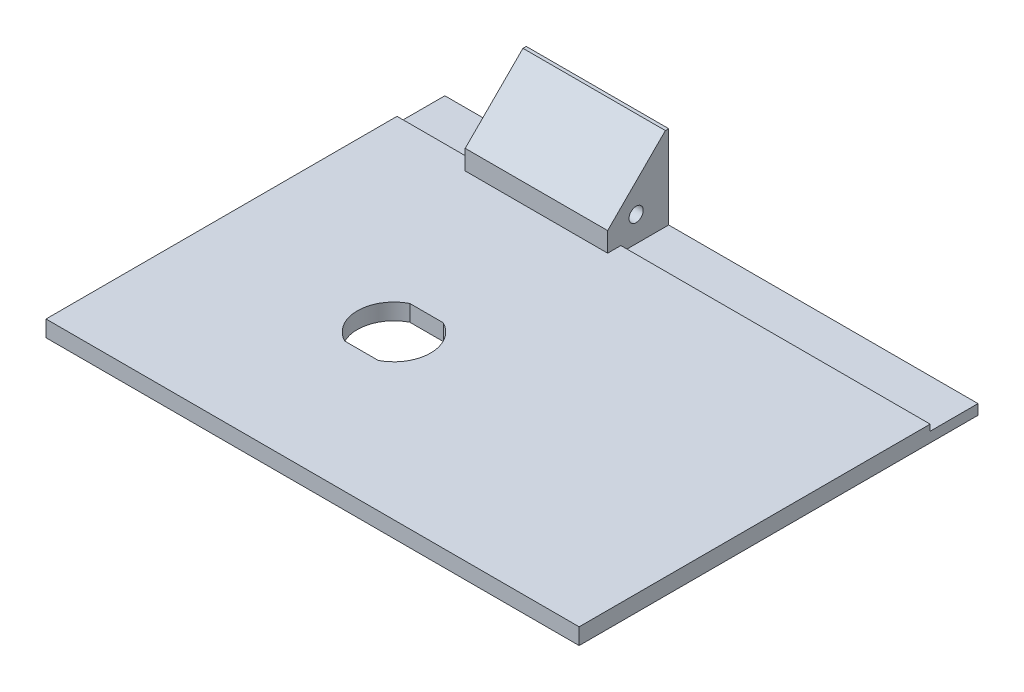
ISO-10303-21;
HEADER;
FILE_DESCRIPTION(('STEP AP214'),'2;1');
FILE_NAME('part.step','',(''),(''),'','','');
FILE_SCHEMA(('AUTOMOTIVE_DESIGN { 1 0 10303 214 1 1 1 1 }'));
ENDSEC;
DATA;
#1=APPLICATION_CONTEXT('core data for automotive mechanical design processes');
#2=APPLICATION_PROTOCOL_DEFINITION('international standard','automotive_design',2000,#1);
#3=PRODUCT_CONTEXT('',#1,'mechanical');
#4=PRODUCT('Part','Part','',(#3));
#5=PRODUCT_RELATED_PRODUCT_CATEGORY('part','',(#4));
#6=PRODUCT_DEFINITION_FORMATION('','',#4);
#7=PRODUCT_DEFINITION_CONTEXT('part definition',#1,'design');
#8=PRODUCT_DEFINITION('design','',#6,#7);
#9=PRODUCT_DEFINITION_SHAPE('','',#8);
#10=(LENGTH_UNIT() NAMED_UNIT(*) SI_UNIT(.MILLI.,.METRE.));
#11=(NAMED_UNIT(*) PLANE_ANGLE_UNIT() SI_UNIT($,.RADIAN.));
#12=(NAMED_UNIT(*) SI_UNIT($,.STERADIAN.) SOLID_ANGLE_UNIT());
#13=UNCERTAINTY_MEASURE_WITH_UNIT(LENGTH_MEASURE(1.E-05),#10,'distance_accuracy_value','');
#14=(GEOMETRIC_REPRESENTATION_CONTEXT(3) GLOBAL_UNCERTAINTY_ASSIGNED_CONTEXT((#13)) GLOBAL_UNIT_ASSIGNED_CONTEXT((#10,
#11,#12)) REPRESENTATION_CONTEXT('',''));
#15=CARTESIAN_POINT('',(0.,0.,0.));
#16=DIRECTION('',(0.,0.,1.));
#17=DIRECTION('',(1.,0.,0.));
#18=AXIS2_PLACEMENT_3D('',#15,#16,#17);
#19=CARTESIAN_POINT('',(77.3453577404821,4.,-37.25));
#20=DIRECTION('',(0.,0.,1.));
#21=DIRECTION('',(1.,0.,0.));
#22=AXIS2_PLACEMENT_3D('',#19,#20,#21);
#23=PLANE('',#22);
#24=DIRECTION('',(-1.,0.,0.));
#25=VECTOR('',#24,1.);
#26=CARTESIAN_POINT('',(77.3453577404821,2.5,-37.25));
#27=LINE('',#26,#25);
#28=CARTESIAN_POINT('',(65.5,2.5,-37.25));
#29=VERTEX_POINT('',#28);
#30=CARTESIAN_POINT('',(-10.5,2.5,-37.25));
#31=VERTEX_POINT('',#30);
#32=EDGE_CURVE('E160',#29,#31,#27,.T.);
#33=ORIENTED_EDGE('',*,*,#32,.T.);
#34=DIRECTION('',(0.,-1.,0.));
#35=VECTOR('',#34,1.);
#36=CARTESIAN_POINT('',(-10.5,4.,-37.25));
#37=LINE('',#36,#35);
#38=CARTESIAN_POINT('',(-10.5,4.,-37.25));
#39=VERTEX_POINT('',#38);
#40=EDGE_CURVE('E155',#39,#31,#37,.T.);
#41=ORIENTED_EDGE('',*,*,#40,.F.);
#42=DIRECTION('',(-1.,0.,0.));
#43=VECTOR('',#42,1.);
#44=CARTESIAN_POINT('',(77.3453577404821,4.,-37.25));
#45=LINE('',#44,#43);
#46=CARTESIAN_POINT('',(65.5,4.,-37.25));
#47=VERTEX_POINT('',#46);
#48=EDGE_CURVE('E157',#47,#39,#45,.T.);
#49=ORIENTED_EDGE('',*,*,#48,.F.);
#50=DIRECTION('',(0.,-1.,0.));
#51=VECTOR('',#50,1.);
#52=CARTESIAN_POINT('',(65.5,4.,-37.25));
#53=LINE('',#52,#51);
#54=EDGE_CURVE('E176',#47,#29,#53,.T.);
#55=ORIENTED_EDGE('',*,*,#54,.T.);
#56=EDGE_LOOP('',(#33,#41,#49,#55));
#57=FACE_BOUND('',#56,.T.);
#58=ADVANCED_FACE('F36',(#57),#23,.F.);
#59=CARTESIAN_POINT('',(77.3453577404821,2.5,-49.));
#60=DIRECTION('',(0.,-1.,0.));
#61=DIRECTION('',(0.,0.,-1.));
#62=AXIS2_PLACEMENT_3D('',#59,#60,#61);
#63=PLANE('',#62);
#64=DIRECTION('',(-1.,0.,0.));
#65=VECTOR('',#64,1.);
#66=CARTESIAN_POINT('',(77.3453577404821,2.5,-49.));
#67=LINE('',#66,#65);
#68=CARTESIAN_POINT('',(65.5,2.5,-49.));
#69=VERTEX_POINT('',#68);
#70=CARTESIAN_POINT('',(-10.5,2.5,-49.));
#71=VERTEX_POINT('',#70);
#72=EDGE_CURVE('E211',#69,#71,#67,.T.);
#73=ORIENTED_EDGE('',*,*,#72,.T.);
#74=DIRECTION('',(0.,0.,-1.));
#75=VECTOR('',#74,1.);
#76=CARTESIAN_POINT('',(-10.5,2.5,-2.21787188879326));
#77=LINE('',#76,#75);
#78=EDGE_CURVE('E165',#31,#71,#77,.T.);
#79=ORIENTED_EDGE('',*,*,#78,.F.);
#80=ORIENTED_EDGE('',*,*,#32,.F.);
#81=DIRECTION('',(0.,0.,-1.));
#82=VECTOR('',#81,1.);
#83=CARTESIAN_POINT('',(65.5,2.5,-49.));
#84=LINE('',#83,#82);
#85=EDGE_CURVE('E202',#29,#69,#84,.T.);
#86=ORIENTED_EDGE('',*,*,#85,.T.);
#87=EDGE_LOOP('',(#73,#79,#80,#86));
#88=FACE_BOUND('',#87,.T.);
#89=ADVANCED_FACE('F313',(#88),#63,.F.);
#90=CARTESIAN_POINT('',(-65.5,4.,49.));
#91=DIRECTION('',(1.,0.,0.));
#92=DIRECTION('',(0.,0.,-1.));
#93=AXIS2_PLACEMENT_3D('',#90,#91,#92);
#94=PLANE('',#93);
#95=DIRECTION('',(0.,0.,1.));
#96=VECTOR('',#95,1.);
#97=CARTESIAN_POINT('',(-65.5,4.,49.));
#98=LINE('',#97,#96);
#99=CARTESIAN_POINT('',(-65.5,4.,-37.25));
#100=VERTEX_POINT('',#99);
#101=CARTESIAN_POINT('',(-65.5,4.,49.));
#102=VERTEX_POINT('',#101);
#103=EDGE_CURVE('E248',#100,#102,#98,.T.);
#104=ORIENTED_EDGE('',*,*,#103,.F.);
#105=DIRECTION('',(0.,1.,0.));
#106=VECTOR('',#105,1.);
#107=CARTESIAN_POINT('',(-65.5,4.,-37.25));
#108=LINE('',#107,#106);
#109=CARTESIAN_POINT('',(-65.5,2.5,-37.25));
#110=VERTEX_POINT('',#109);
#111=EDGE_CURVE('E205',#110,#100,#108,.T.);
#112=ORIENTED_EDGE('',*,*,#111,.F.);
#113=DIRECTION('',(0.,0.,1.));
#114=VECTOR('',#113,1.);
#115=CARTESIAN_POINT('',(-65.5,2.5,-49.));
#116=LINE('',#115,#114);
#117=CARTESIAN_POINT('',(-65.5,2.5,-49.));
#118=VERTEX_POINT('',#117);
#119=EDGE_CURVE('E200',#118,#110,#116,.T.);
#120=ORIENTED_EDGE('',*,*,#119,.F.);
#121=DIRECTION('',(0.,-1.,0.));
#122=VECTOR('',#121,1.);
#123=CARTESIAN_POINT('',(-65.5,4.,-49.));
#124=LINE('',#123,#122);
#125=CARTESIAN_POINT('',(-65.5,0.,-49.));
#126=VERTEX_POINT('',#125);
#127=EDGE_CURVE('E254',#118,#126,#124,.T.);
#128=ORIENTED_EDGE('',*,*,#127,.T.);
#129=DIRECTION('',(0.,0.,1.));
#130=VECTOR('',#129,1.);
#131=CARTESIAN_POINT('',(-65.5,0.,49.));
#132=LINE('',#131,#130);
#133=CARTESIAN_POINT('',(-65.5,0.,49.));
#134=VERTEX_POINT('',#133);
#135=EDGE_CURVE('E241',#126,#134,#132,.T.);
#136=ORIENTED_EDGE('',*,*,#135,.T.);
#137=DIRECTION('',(0.,-1.,0.));
#138=VECTOR('',#137,1.);
#139=CARTESIAN_POINT('',(-65.5,4.,49.));
#140=LINE('',#139,#138);
#141=EDGE_CURVE('E269',#102,#134,#140,.T.);
#142=ORIENTED_EDGE('',*,*,#141,.F.);
#143=EDGE_LOOP('',(#104,#112,#120,#128,#136,#142));
#144=FACE_BOUND('',#143,.T.);
#145=ADVANCED_FACE('F38',(#144),#94,.F.);
#146=CARTESIAN_POINT('',(65.5,4.,49.));
#147=DIRECTION('',(0.,0.,-1.));
#148=DIRECTION('',(-1.,0.,0.));
#149=AXIS2_PLACEMENT_3D('',#146,#147,#148);
#150=PLANE('',#149);
#151=DIRECTION('',(1.,0.,0.));
#152=VECTOR('',#151,1.);
#153=CARTESIAN_POINT('',(65.5,0.,49.));
#154=LINE('',#153,#152);
#155=CARTESIAN_POINT('',(65.5,0.,49.));
#156=VERTEX_POINT('',#155);
#157=EDGE_CURVE('E257',#134,#156,#154,.T.);
#158=ORIENTED_EDGE('',*,*,#157,.T.);
#159=DIRECTION('',(0.,-1.,0.));
#160=VECTOR('',#159,1.);
#161=CARTESIAN_POINT('',(65.5,4.,49.));
#162=LINE('',#161,#160);
#163=CARTESIAN_POINT('',(65.5,4.,49.));
#164=VERTEX_POINT('',#163);
#165=EDGE_CURVE('E267',#164,#156,#162,.T.);
#166=ORIENTED_EDGE('',*,*,#165,.F.);
#167=DIRECTION('',(1.,0.,0.));
#168=VECTOR('',#167,1.);
#169=CARTESIAN_POINT('',(65.5,4.,49.));
#170=LINE('',#169,#168);
#171=EDGE_CURVE('E250',#102,#164,#170,.T.);
#172=ORIENTED_EDGE('',*,*,#171,.F.);
#173=ORIENTED_EDGE('',*,*,#141,.T.);
#174=EDGE_LOOP('',(#158,#166,#172,#173));
#175=FACE_BOUND('',#174,.T.);
#176=ADVANCED_FACE('F306',(#175),#150,.F.);
#177=CARTESIAN_POINT('',(65.5,4.,49.));
#178=DIRECTION('',(-1.,0.,0.));
#179=DIRECTION('',(0.,0.,1.));
#180=AXIS2_PLACEMENT_3D('',#177,#178,#179);
#181=PLANE('',#180);
#182=ORIENTED_EDGE('',*,*,#85,.F.);
#183=ORIENTED_EDGE('',*,*,#54,.F.);
#184=DIRECTION('',(0.,0.,-1.));
#185=VECTOR('',#184,1.);
#186=CARTESIAN_POINT('',(65.5,4.,49.));
#187=LINE('',#186,#185);
#188=EDGE_CURVE('E175',#164,#47,#187,.T.);
#189=ORIENTED_EDGE('',*,*,#188,.F.);
#190=ORIENTED_EDGE('',*,*,#165,.T.);
#191=DIRECTION('',(0.,0.,-1.));
#192=VECTOR('',#191,1.);
#193=CARTESIAN_POINT('',(65.5,0.,49.));
#194=LINE('',#193,#192);
#195=CARTESIAN_POINT('',(65.5,0.,-49.));
#196=VERTEX_POINT('',#195);
#197=EDGE_CURVE('E259',#156,#196,#194,.T.);
#198=ORIENTED_EDGE('',*,*,#197,.T.);
#199=DIRECTION('',(0.,-1.,0.));
#200=VECTOR('',#199,1.);
#201=CARTESIAN_POINT('',(65.5,4.,-49.));
#202=LINE('',#201,#200);
#203=EDGE_CURVE('E265',#69,#196,#202,.T.);
#204=ORIENTED_EDGE('',*,*,#203,.F.);
#205=EDGE_LOOP('',(#182,#183,#189,#190,#198,#204));
#206=FACE_BOUND('',#205,.T.);
#207=ADVANCED_FACE('F310',(#206),#181,.F.);
#208=CARTESIAN_POINT('',(65.5,4.,-49.));
#209=DIRECTION('',(0.,0.,1.));
#210=DIRECTION('',(1.,0.,0.));
#211=AXIS2_PLACEMENT_3D('',#208,#209,#210);
#212=PLANE('',#211);
#213=ORIENTED_EDGE('',*,*,#127,.F.);
#214=CARTESIAN_POINT('',(-45.5,2.5,-49.));
#215=VERTEX_POINT('',#214);
#216=EDGE_CURVE('E207',#215,#118,#67,.T.);
#217=ORIENTED_EDGE('',*,*,#216,.F.);
#218=DIRECTION('',(0.,-1.,0.));
#219=VECTOR('',#218,1.);
#220=CARTESIAN_POINT('',(-45.5,23.,-49.));
#221=LINE('',#220,#219);
#222=CARTESIAN_POINT('',(-45.5,23.,-49.));
#223=VERTEX_POINT('',#222);
#224=EDGE_CURVE('E193',#223,#215,#221,.T.);
#225=ORIENTED_EDGE('',*,*,#224,.F.);
#226=DIRECTION('',(-1.,0.,0.));
#227=VECTOR('',#226,1.);
#228=CARTESIAN_POINT('',(-45.5,23.,-49.));
#229=LINE('',#228,#227);
#230=CARTESIAN_POINT('',(-10.5,23.,-49.));
#231=VERTEX_POINT('',#230);
#232=EDGE_CURVE('E196',#231,#223,#229,.T.);
#233=ORIENTED_EDGE('',*,*,#232,.F.);
#234=DIRECTION('',(0.,-1.,0.));
#235=VECTOR('',#234,1.);
#236=CARTESIAN_POINT('',(-10.5,23.,-49.));
#237=LINE('',#236,#235);
#238=EDGE_CURVE('E195',#231,#71,#237,.T.);
#239=ORIENTED_EDGE('',*,*,#238,.T.);
#240=ORIENTED_EDGE('',*,*,#72,.F.);
#241=ORIENTED_EDGE('',*,*,#203,.T.);
#242=DIRECTION('',(-1.,0.,0.));
#243=VECTOR('',#242,1.);
#244=CARTESIAN_POINT('',(65.5,0.,-49.));
#245=LINE('',#244,#243);
#246=EDGE_CURVE('E251',#196,#126,#245,.T.);
#247=ORIENTED_EDGE('',*,*,#246,.T.);
#248=EDGE_LOOP('',(#213,#217,#225,#233,#239,#240,#241,#247));
#249=FACE_BOUND('',#248,.T.);
#250=ADVANCED_FACE('F320',(#249),#212,.F.);
#251=CARTESIAN_POINT('',(0.,4.,0.));
#252=DIRECTION('',(0.,1.,0.));
#253=DIRECTION('',(0.,0.,1.));
#254=AXIS2_PLACEMENT_3D('',#251,#252,#253);
#255=PLANE('',#254);
#256=DIRECTION('',(0.,0.,1.));
#257=VECTOR('',#256,1.);
#258=CARTESIAN_POINT('',(-45.5,4.,-49.));
#259=LINE('',#258,#257);
#260=CARTESIAN_POINT('',(-45.5,4.,-37.25));
#261=VERTEX_POINT('',#260);
#262=CARTESIAN_POINT('',(-45.5,4.,-34.));
#263=VERTEX_POINT('',#262);
#264=EDGE_CURVE('E44',#261,#263,#259,.T.);
#265=ORIENTED_EDGE('',*,*,#264,.F.);
#266=EDGE_CURVE('E177',#261,#100,#45,.T.);
#267=ORIENTED_EDGE('',*,*,#266,.T.);
#268=ORIENTED_EDGE('',*,*,#103,.T.);
#269=ORIENTED_EDGE('',*,*,#171,.T.);
#270=ORIENTED_EDGE('',*,*,#188,.T.);
#271=ORIENTED_EDGE('',*,*,#48,.T.);
#272=DIRECTION('',(0.,0.,-1.));
#273=VECTOR('',#272,1.);
#274=CARTESIAN_POINT('',(-10.5,4.,-49.));
#275=LINE('',#274,#273);
#276=CARTESIAN_POINT('',(-10.5,4.,-34.));
#277=VERTEX_POINT('',#276);
#278=EDGE_CURVE('E173',#277,#39,#275,.T.);
#279=ORIENTED_EDGE('',*,*,#278,.F.);
#280=DIRECTION('',(1.,0.,0.));
#281=VECTOR('',#280,1.);
#282=CARTESIAN_POINT('',(-45.5,4.,-34.));
#283=LINE('',#282,#281);
#284=EDGE_CURVE('E184',#263,#277,#283,.T.);
#285=ORIENTED_EDGE('',*,*,#284,.F.);
#286=EDGE_LOOP('',(#265,#267,#268,#269,#270,#271,#279,#285));
#287=FACE_BOUND('',#286,.T.);
#288=CARTESIAN_POINT('',(-20.,4.,9.00000000000001));
#289=DIRECTION('',(0.,1.,0.));
#290=DIRECTION('',(0.,0.,1.));
#291=AXIS2_PLACEMENT_3D('',#288,#289,#290);
#292=CIRCLE('',#291,9.00000000000001);
#293=CARTESIAN_POINT('',(-24.1231056256177,4.,1.00000000000003));
#294=VERTEX_POINT('',#293);
#295=CARTESIAN_POINT('',(-24.1231056256177,4.,17.));
#296=VERTEX_POINT('',#295);
#297=EDGE_CURVE('E215',#294,#296,#292,.T.);
#298=ORIENTED_EDGE('',*,*,#297,.F.);
#299=DIRECTION('',(-1.,0.,0.));
#300=VECTOR('',#299,1.);
#301=CARTESIAN_POINT('',(-24.1231056256177,4.,1.00000000000003));
#302=LINE('',#301,#300);
#303=CARTESIAN_POINT('',(-15.8768943743823,4.,1.00000000000003));
#304=VERTEX_POINT('',#303);
#305=EDGE_CURVE('E220',#304,#294,#302,.T.);
#306=ORIENTED_EDGE('',*,*,#305,.F.);
#307=CARTESIAN_POINT('',(-20.,4.,9.00000000000001));
#308=DIRECTION('',(0.,1.,0.));
#309=DIRECTION('',(0.,0.,1.));
#310=AXIS2_PLACEMENT_3D('',#307,#308,#309);
#311=CIRCLE('',#310,9.00000000000001);
#312=CARTESIAN_POINT('',(-15.8768943743824,4.,17.));
#313=VERTEX_POINT('',#312);
#314=EDGE_CURVE('E234',#313,#304,#311,.T.);
#315=ORIENTED_EDGE('',*,*,#314,.F.);
#316=DIRECTION('',(1.,0.,0.));
#317=VECTOR('',#316,1.);
#318=CARTESIAN_POINT('',(-24.1231056256177,4.,17.));
#319=LINE('',#318,#317);
#320=EDGE_CURVE('E231',#296,#313,#319,.T.);
#321=ORIENTED_EDGE('',*,*,#320,.F.);
#322=EDGE_LOOP('',(#298,#306,#315,#321));
#323=FACE_BOUND('',#322,.T.);
#324=ADVANCED_FACE('F171',(#287,#323),#255,.T.);
#325=CARTESIAN_POINT('',(0.,0.,0.));
#326=DIRECTION('',(0.,1.,0.));
#327=DIRECTION('',(0.,0.,1.));
#328=AXIS2_PLACEMENT_3D('',#325,#326,#327);
#329=PLANE('',#328);
#330=DIRECTION('',(-1.,0.,0.));
#331=VECTOR('',#330,1.);
#332=CARTESIAN_POINT('',(-24.1231056256177,0.,1.00000000000003));
#333=LINE('',#332,#331);
#334=CARTESIAN_POINT('',(-15.8768943743823,0.,1.00000000000003));
#335=VERTEX_POINT('',#334);
#336=CARTESIAN_POINT('',(-24.1231056256177,0.,1.00000000000003));
#337=VERTEX_POINT('',#336);
#338=EDGE_CURVE('E226',#335,#337,#333,.T.);
#339=ORIENTED_EDGE('',*,*,#338,.T.);
#340=CARTESIAN_POINT('',(-20.,0.,9.00000000000001));
#341=DIRECTION('',(0.,1.,0.));
#342=DIRECTION('',(0.,0.,1.));
#343=AXIS2_PLACEMENT_3D('',#340,#341,#342);
#344=CIRCLE('',#343,9.00000000000001);
#345=CARTESIAN_POINT('',(-24.1231056256177,0.,17.));
#346=VERTEX_POINT('',#345);
#347=EDGE_CURVE('E216',#337,#346,#344,.T.);
#348=ORIENTED_EDGE('',*,*,#347,.T.);
#349=DIRECTION('',(1.,0.,0.));
#350=VECTOR('',#349,1.);
#351=CARTESIAN_POINT('',(-24.1231056256177,0.,17.));
#352=LINE('',#351,#350);
#353=CARTESIAN_POINT('',(-15.8768943743824,0.,17.));
#354=VERTEX_POINT('',#353);
#355=EDGE_CURVE('E219',#346,#354,#352,.T.);
#356=ORIENTED_EDGE('',*,*,#355,.T.);
#357=CARTESIAN_POINT('',(-20.,0.,9.00000000000001));
#358=DIRECTION('',(0.,1.,0.));
#359=DIRECTION('',(0.,0.,1.));
#360=AXIS2_PLACEMENT_3D('',#357,#358,#359);
#361=CIRCLE('',#360,9.00000000000001);
#362=EDGE_CURVE('E223',#354,#335,#361,.T.);
#363=ORIENTED_EDGE('',*,*,#362,.T.);
#364=EDGE_LOOP('',(#339,#348,#356,#363));
#365=FACE_BOUND('',#364,.T.);
#366=ORIENTED_EDGE('',*,*,#135,.F.);
#367=ORIENTED_EDGE('',*,*,#246,.F.);
#368=ORIENTED_EDGE('',*,*,#197,.F.);
#369=ORIENTED_EDGE('',*,*,#157,.F.);
#370=EDGE_LOOP('',(#366,#367,#368,#369));
#371=FACE_BOUND('',#370,.T.);
#372=ADVANCED_FACE('F331',(#365,#371),#329,.F.);
#373=CARTESIAN_POINT('',(-20.,0.,9.00000000000001));
#374=DIRECTION('',(0.,1.,0.));
#375=DIRECTION('',(0.,0.,1.));
#376=AXIS2_PLACEMENT_3D('',#373,#374,#375);
#377=CYLINDRICAL_SURFACE('',#376,9.00000000000001);
#378=ORIENTED_EDGE('',*,*,#297,.T.);
#379=DIRECTION('',(0.,1.,0.));
#380=VECTOR('',#379,1.);
#381=CARTESIAN_POINT('',(-24.1231056256177,0.,17.));
#382=LINE('',#381,#380);
#383=EDGE_CURVE('E229',#346,#296,#382,.T.);
#384=ORIENTED_EDGE('',*,*,#383,.F.);
#385=ORIENTED_EDGE('',*,*,#347,.F.);
#386=DIRECTION('',(0.,1.,0.));
#387=VECTOR('',#386,1.);
#388=CARTESIAN_POINT('',(-24.1231056256177,0.,1.00000000000003));
#389=LINE('',#388,#387);
#390=EDGE_CURVE('E239',#337,#294,#389,.T.);
#391=ORIENTED_EDGE('',*,*,#390,.T.);
#392=EDGE_LOOP('',(#378,#384,#385,#391));
#393=FACE_BOUND('',#392,.T.);
#394=ADVANCED_FACE('F333',(#393),#377,.F.);
#395=CARTESIAN_POINT('',(-24.1231056256177,0.,1.00000000000003));
#396=DIRECTION('',(0.,0.,-1.));
#397=DIRECTION('',(-1.,0.,0.));
#398=AXIS2_PLACEMENT_3D('',#395,#396,#397);
#399=PLANE('',#398);
#400=ORIENTED_EDGE('',*,*,#305,.T.);
#401=ORIENTED_EDGE('',*,*,#390,.F.);
#402=ORIENTED_EDGE('',*,*,#338,.F.);
#403=DIRECTION('',(0.,1.,0.));
#404=VECTOR('',#403,1.);
#405=CARTESIAN_POINT('',(-15.8768943743823,0.,1.00000000000003));
#406=LINE('',#405,#404);
#407=EDGE_CURVE('E242',#335,#304,#406,.T.);
#408=ORIENTED_EDGE('',*,*,#407,.T.);
#409=EDGE_LOOP('',(#400,#401,#402,#408));
#410=FACE_BOUND('',#409,.T.);
#411=ADVANCED_FACE('F340',(#410),#399,.F.);
#412=CARTESIAN_POINT('',(-20.,0.,9.00000000000001));
#413=DIRECTION('',(0.,1.,0.));
#414=DIRECTION('',(0.,0.,1.));
#415=AXIS2_PLACEMENT_3D('',#412,#413,#414);
#416=CYLINDRICAL_SURFACE('',#415,9.00000000000001);
#417=ORIENTED_EDGE('',*,*,#314,.T.);
#418=ORIENTED_EDGE('',*,*,#407,.F.);
#419=ORIENTED_EDGE('',*,*,#362,.F.);
#420=DIRECTION('',(0.,1.,0.));
#421=VECTOR('',#420,1.);
#422=CARTESIAN_POINT('',(-15.8768943743824,0.,17.));
#423=LINE('',#422,#421);
#424=EDGE_CURVE('E244',#354,#313,#423,.T.);
#425=ORIENTED_EDGE('',*,*,#424,.T.);
#426=EDGE_LOOP('',(#417,#418,#419,#425));
#427=FACE_BOUND('',#426,.T.);
#428=ADVANCED_FACE('F358',(#427),#416,.F.);
#429=CARTESIAN_POINT('',(-24.1231056256177,0.,17.));
#430=DIRECTION('',(0.,0.,1.));
#431=DIRECTION('',(1.,0.,0.));
#432=AXIS2_PLACEMENT_3D('',#429,#430,#431);
#433=PLANE('',#432);
#434=ORIENTED_EDGE('',*,*,#320,.T.);
#435=ORIENTED_EDGE('',*,*,#424,.F.);
#436=ORIENTED_EDGE('',*,*,#355,.F.);
#437=ORIENTED_EDGE('',*,*,#383,.T.);
#438=EDGE_LOOP('',(#434,#435,#436,#437));
#439=FACE_BOUND('',#438,.T.);
#440=ADVANCED_FACE('F353',(#439),#433,.F.);
#441=ORIENTED_EDGE('',*,*,#266,.F.);
#442=DIRECTION('',(0.,1.,0.));
#443=VECTOR('',#442,1.);
#444=CARTESIAN_POINT('',(-45.5,4.,-37.25));
#445=LINE('',#444,#443);
#446=CARTESIAN_POINT('',(-45.5,2.5,-37.25));
#447=VERTEX_POINT('',#446);
#448=EDGE_CURVE('E290',#447,#261,#445,.T.);
#449=ORIENTED_EDGE('',*,*,#448,.F.);
#450=EDGE_CURVE('E210',#447,#110,#27,.T.);
#451=ORIENTED_EDGE('',*,*,#450,.T.);
#452=ORIENTED_EDGE('',*,*,#111,.T.);
#453=EDGE_LOOP('',(#441,#449,#451,#452));
#454=FACE_BOUND('',#453,.T.);
#455=ADVANCED_FACE('F300',(#454),#23,.F.);
#456=ORIENTED_EDGE('',*,*,#450,.F.);
#457=DIRECTION('',(0.,0.,-1.));
#458=VECTOR('',#457,1.);
#459=CARTESIAN_POINT('',(-45.5,2.5,-2.21787188879326));
#460=LINE('',#459,#458);
#461=EDGE_CURVE('E292',#447,#215,#460,.T.);
#462=ORIENTED_EDGE('',*,*,#461,.T.);
#463=ORIENTED_EDGE('',*,*,#216,.T.);
#464=ORIENTED_EDGE('',*,*,#119,.T.);
#465=EDGE_LOOP('',(#456,#462,#463,#464));
#466=FACE_BOUND('',#465,.T.);
#467=ADVANCED_FACE('F327',(#466),#63,.F.);
#468=CARTESIAN_POINT('',(-45.5,23.,-49.));
#469=DIRECTION('',(1.,0.,0.));
#470=DIRECTION('',(0.,0.,-1.));
#471=AXIS2_PLACEMENT_3D('',#468,#469,#470);
#472=PLANE('',#471);
#473=CARTESIAN_POINT('',(-45.5,8.75,-41.));
#474=DIRECTION('',(-1.,0.,0.));
#475=DIRECTION('',(0.,0.,1.));
#476=AXIS2_PLACEMENT_3D('',#473,#474,#475);
#477=CIRCLE('',#476,1.75);
#478=CARTESIAN_POINT('',(-45.5,8.75,-39.25));
#479=VERTEX_POINT('',#478);
#480=EDGE_CURVE('E281',#479,#479,#477,.T.);
#481=ORIENTED_EDGE('',*,*,#480,.F.);
#482=EDGE_LOOP('',(#481));
#483=FACE_BOUND('',#482,.T.);
#484=DIRECTION('',(0.,-1.,0.));
#485=VECTOR('',#484,1.);
#486=CARTESIAN_POINT('',(-45.5,23.,-34.));
#487=LINE('',#486,#485);
#488=CARTESIAN_POINT('',(-45.5,8.81170329696486,-34.));
#489=VERTEX_POINT('',#488);
#490=EDGE_CURVE('E58',#489,#263,#487,.T.);
#491=ORIENTED_EDGE('',*,*,#490,.F.);
#492=DIRECTION('',(0.,0.707106781186551,-0.707106781186544));
#493=VECTOR('',#492,1.);
#494=CARTESIAN_POINT('',(-45.5,23.4058516484825,-48.5941483515175));
#495=LINE('',#494,#493);
#496=CARTESIAN_POINT('',(-45.5,23.,-48.188296703035));
#497=VERTEX_POINT('',#496);
#498=EDGE_CURVE('E284',#489,#497,#495,.T.);
#499=ORIENTED_EDGE('',*,*,#498,.T.);
#500=DIRECTION('',(0.,0.,1.));
#501=VECTOR('',#500,1.);
#502=CARTESIAN_POINT('',(-45.5,23.,-49.));
#503=LINE('',#502,#501);
#504=EDGE_CURVE('E183',#223,#497,#503,.T.);
#505=ORIENTED_EDGE('',*,*,#504,.F.);
#506=ORIENTED_EDGE('',*,*,#224,.T.);
#507=ORIENTED_EDGE('',*,*,#461,.F.);
#508=ORIENTED_EDGE('',*,*,#448,.T.);
#509=ORIENTED_EDGE('',*,*,#264,.T.);
#510=EDGE_LOOP('',(#491,#499,#505,#506,#507,#508,#509));
#511=FACE_BOUND('',#510,.T.);
#512=ADVANCED_FACE('F296',(#483,#511),#472,.F.);
#513=CARTESIAN_POINT('',(-45.5,23.,-34.));
#514=DIRECTION('',(0.,0.,-1.));
#515=DIRECTION('',(-1.,0.,0.));
#516=AXIS2_PLACEMENT_3D('',#513,#514,#515);
#517=PLANE('',#516);
#518=DIRECTION('',(0.,-1.,0.));
#519=VECTOR('',#518,1.);
#520=CARTESIAN_POINT('',(-10.5,23.,-34.));
#521=LINE('',#520,#519);
#522=CARTESIAN_POINT('',(-10.5,8.81170329696486,-34.));
#523=VERTEX_POINT('',#522);
#524=EDGE_CURVE('E182',#523,#277,#521,.T.);
#525=ORIENTED_EDGE('',*,*,#524,.F.);
#526=DIRECTION('',(-1.,0.,0.));
#527=VECTOR('',#526,1.);
#528=CARTESIAN_POINT('',(65.5,8.81170329696486,-34.));
#529=LINE('',#528,#527);
#530=EDGE_CURVE('E288',#523,#489,#529,.T.);
#531=ORIENTED_EDGE('',*,*,#530,.T.);
#532=ORIENTED_EDGE('',*,*,#490,.T.);
#533=ORIENTED_EDGE('',*,*,#284,.T.);
#534=EDGE_LOOP('',(#525,#531,#532,#533));
#535=FACE_BOUND('',#534,.T.);
#536=ADVANCED_FACE('F428',(#535),#517,.F.);
#537=CARTESIAN_POINT('',(-10.5,23.,-49.));
#538=DIRECTION('',(-1.,0.,0.));
#539=DIRECTION('',(0.,0.,1.));
#540=AXIS2_PLACEMENT_3D('',#537,#538,#539);
#541=PLANE('',#540);
#542=CARTESIAN_POINT('',(-10.5,8.75,-41.));
#543=DIRECTION('',(-1.,0.,0.));
#544=DIRECTION('',(0.,0.,1.));
#545=AXIS2_PLACEMENT_3D('',#542,#543,#544);
#546=CIRCLE('',#545,1.75);
#547=CARTESIAN_POINT('',(-10.5,8.75,-39.25));
#548=VERTEX_POINT('',#547);
#549=EDGE_CURVE('E189',#548,#548,#546,.F.);
#550=ORIENTED_EDGE('',*,*,#549,.F.);
#551=EDGE_LOOP('',(#550));
#552=FACE_BOUND('',#551,.T.);
#553=DIRECTION('',(0.,0.,-1.));
#554=VECTOR('',#553,1.);
#555=CARTESIAN_POINT('',(-10.5,23.,-49.));
#556=LINE('',#555,#554);
#557=CARTESIAN_POINT('',(-10.5,23.,-48.188296703035));
#558=VERTEX_POINT('',#557);
#559=EDGE_CURVE('E187',#558,#231,#556,.T.);
#560=ORIENTED_EDGE('',*,*,#559,.F.);
#561=DIRECTION('',(0.,-0.707106781186551,0.707106781186544));
#562=VECTOR('',#561,1.);
#563=CARTESIAN_POINT('',(-10.5,23.4058516484825,-48.5941483515175));
#564=LINE('',#563,#562);
#565=EDGE_CURVE('E50',#558,#523,#564,.T.);
#566=ORIENTED_EDGE('',*,*,#565,.T.);
#567=ORIENTED_EDGE('',*,*,#524,.T.);
#568=ORIENTED_EDGE('',*,*,#278,.T.);
#569=ORIENTED_EDGE('',*,*,#40,.T.);
#570=ORIENTED_EDGE('',*,*,#78,.T.);
#571=ORIENTED_EDGE('',*,*,#238,.F.);
#572=EDGE_LOOP('',(#560,#566,#567,#568,#569,#570,#571));
#573=FACE_BOUND('',#572,.T.);
#574=ADVANCED_FACE('F180',(#552,#573),#541,.F.);
#575=CARTESIAN_POINT('',(0.,23.,0.));
#576=DIRECTION('',(0.,1.,0.));
#577=DIRECTION('',(0.,0.,1.));
#578=AXIS2_PLACEMENT_3D('',#575,#576,#577);
#579=PLANE('',#578);
#580=DIRECTION('',(-1.,0.,0.));
#581=VECTOR('',#580,1.);
#582=CARTESIAN_POINT('',(0.,23.,-48.188296703035));
#583=LINE('',#582,#581);
#584=EDGE_CURVE('E12',#558,#497,#583,.T.);
#585=ORIENTED_EDGE('',*,*,#584,.F.);
#586=ORIENTED_EDGE('',*,*,#559,.T.);
#587=ORIENTED_EDGE('',*,*,#232,.T.);
#588=ORIENTED_EDGE('',*,*,#504,.T.);
#589=EDGE_LOOP('',(#585,#586,#587,#588));
#590=FACE_BOUND('',#589,.T.);
#591=ADVANCED_FACE('F324',(#590),#579,.T.);
#592=CARTESIAN_POINT('',(-5.55025253169417,8.75,-41.));
#593=DIRECTION('',(-1.,0.,0.));
#594=DIRECTION('',(0.,0.,1.));
#595=AXIS2_PLACEMENT_3D('',#592,#593,#594);
#596=CYLINDRICAL_SURFACE('',#595,1.75);
#597=ORIENTED_EDGE('',*,*,#549,.T.);
#598=EDGE_LOOP('',(#597));
#599=FACE_BOUND('',#598,.T.);
#600=ORIENTED_EDGE('',*,*,#480,.T.);
#601=EDGE_LOOP('',(#600));
#602=FACE_BOUND('',#601,.T.);
#603=ADVANCED_FACE('F414',(#599,#602),#596,.F.);
#604=CARTESIAN_POINT('',(65.5,8.81170329696486,-34.));
#605=DIRECTION('',(0.,-0.707106781186544,-0.707106781186551));
#606=DIRECTION('',(0.,0.707106781186551,-0.707106781186544));
#607=AXIS2_PLACEMENT_3D('',#604,#605,#606);
#608=PLANE('',#607);
#609=ORIENTED_EDGE('',*,*,#530,.F.);
#610=ORIENTED_EDGE('',*,*,#565,.F.);
#611=ORIENTED_EDGE('',*,*,#584,.T.);
#612=ORIENTED_EDGE('',*,*,#498,.F.);
#613=EDGE_LOOP('',(#609,#610,#611,#612));
#614=FACE_BOUND('',#613,.T.);
#615=ADVANCED_FACE('F325',(#614),#608,.F.);
#616=CLOSED_SHELL('',(#58,#89,#145,#176,#207,#250,#324,#372,#394,#411,#428,#440,#455,#467,#512,
#536,#574,#591,#603,#615));
#617=MANIFOLD_SOLID_BREP('B2',#616);
#618=ADVANCED_BREP_SHAPE_REPRESENTATION('',(#18,#617),#14);
#619=SHAPE_DEFINITION_REPRESENTATION(#9,#618);
ENDSEC;
END-ISO-10303-21;
